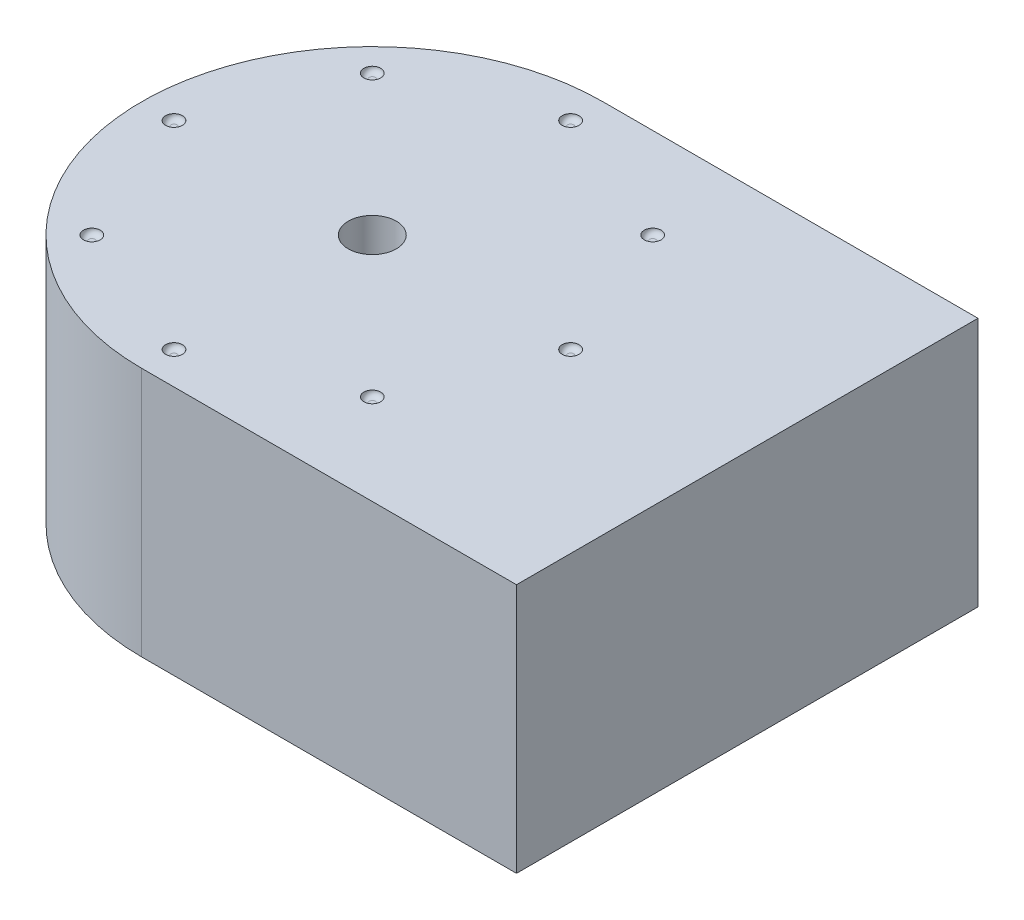
ISO-10303-21;
HEADER;
FILE_DESCRIPTION(('STEP AP214'),'2;1');
FILE_NAME('part.step','',(''),(''),'','','');
FILE_SCHEMA(('AUTOMOTIVE_DESIGN { 1 0 10303 214 1 1 1 1 }'));
ENDSEC;
DATA;
#1=APPLICATION_CONTEXT('core data for automotive mechanical design processes');
#2=APPLICATION_PROTOCOL_DEFINITION('international standard','automotive_design',2000,#1);
#3=PRODUCT_CONTEXT('',#1,'mechanical');
#4=PRODUCT('Part','Part','',(#3));
#5=PRODUCT_RELATED_PRODUCT_CATEGORY('part','',(#4));
#6=PRODUCT_DEFINITION_FORMATION('','',#4);
#7=PRODUCT_DEFINITION_CONTEXT('part definition',#1,'design');
#8=PRODUCT_DEFINITION('design','',#6,#7);
#9=PRODUCT_DEFINITION_SHAPE('','',#8);
#10=(LENGTH_UNIT() NAMED_UNIT(*) SI_UNIT(.MILLI.,.METRE.));
#11=(NAMED_UNIT(*) PLANE_ANGLE_UNIT() SI_UNIT($,.RADIAN.));
#12=(NAMED_UNIT(*) SI_UNIT($,.STERADIAN.) SOLID_ANGLE_UNIT());
#13=UNCERTAINTY_MEASURE_WITH_UNIT(LENGTH_MEASURE(1.E-05),#10,'distance_accuracy_value','');
#14=(GEOMETRIC_REPRESENTATION_CONTEXT(3) GLOBAL_UNCERTAINTY_ASSIGNED_CONTEXT((#13)) GLOBAL_UNIT_ASSIGNED_CONTEXT((#10,
#11,#12)) REPRESENTATION_CONTEXT('',''));
#15=CARTESIAN_POINT('',(0.,0.,0.));
#16=DIRECTION('',(0.,0.,1.));
#17=DIRECTION('',(1.,0.,0.));
#18=AXIS2_PLACEMENT_3D('',#15,#16,#17);
#19=CARTESIAN_POINT('',(0.,52.,-41.25));
#20=DIRECTION('',(0.,1.,0.));
#21=DIRECTION('',(0.,0.,1.));
#22=AXIS2_PLACEMENT_3D('',#19,#20,#21);
#23=DEGENERATE_TOROIDAL_SURFACE('',#22,0.650000000000002,1.1,.T.);
#24=CARTESIAN_POINT('',(0.,50.9,-41.25));
#25=DIRECTION('',(0.,1.,0.));
#26=DIRECTION('',(0.,0.,1.));
#27=AXIS2_PLACEMENT_3D('',#24,#25,#26);
#28=CIRCLE('',#27,0.650000000000002);
#29=CARTESIAN_POINT('',(0.,50.9,-40.6));
#30=VERTEX_POINT('',#29);
#31=EDGE_CURVE('E11',#30,#30,#28,.T.);
#32=ORIENTED_EDGE('',*,*,#31,.F.);
#33=EDGE_LOOP('',(#32));
#34=FACE_BOUND('',#33,.T.);
#35=CARTESIAN_POINT('',(0.,52.,-41.25));
#36=DIRECTION('',(0.,1.,0.));
#37=DIRECTION('',(0.,0.,1.));
#38=AXIS2_PLACEMENT_3D('',#35,#36,#37);
#39=CIRCLE('',#38,1.75);
#40=CARTESIAN_POINT('',(0.,52.,-39.5));
#41=VERTEX_POINT('',#40);
#42=EDGE_CURVE('E110',#41,#41,#39,.T.);
#43=ORIENTED_EDGE('',*,*,#42,.T.);
#44=EDGE_LOOP('',(#43));
#45=FACE_BOUND('',#44,.T.);
#46=ADVANCED_FACE('F40',(#34,#45),#23,.F.);
#47=CARTESIAN_POINT('',(0.,52.,0.));
#48=DIRECTION('',(0.,-1.,0.));
#49=DIRECTION('',(0.,0.,-1.));
#50=AXIS2_PLACEMENT_3D('',#47,#48,#49);
#51=CYLINDRICAL_SURFACE('',#50,48.);
#52=CARTESIAN_POINT('',(0.,0.,0.));
#53=DIRECTION('',(0.,1.,0.));
#54=DIRECTION('',(0.,0.,1.));
#55=AXIS2_PLACEMENT_3D('',#52,#53,#54);
#56=CIRCLE('',#55,48.);
#57=CARTESIAN_POINT('',(0.,0.,-48.));
#58=VERTEX_POINT('',#57);
#59=CARTESIAN_POINT('',(0.,0.,48.));
#60=VERTEX_POINT('',#59);
#61=EDGE_CURVE('E107',#58,#60,#56,.T.);
#62=ORIENTED_EDGE('',*,*,#61,.T.);
#63=DIRECTION('',(0.,-1.,0.));
#64=VECTOR('',#63,1.);
#65=CARTESIAN_POINT('',(0.,52.,48.));
#66=LINE('',#65,#64);
#67=CARTESIAN_POINT('',(0.,52.,48.));
#68=VERTEX_POINT('',#67);
#69=EDGE_CURVE('E48',#68,#60,#66,.T.);
#70=ORIENTED_EDGE('',*,*,#69,.F.);
#71=CARTESIAN_POINT('',(0.,52.,0.));
#72=DIRECTION('',(0.,1.,0.));
#73=DIRECTION('',(0.,0.,1.));
#74=AXIS2_PLACEMENT_3D('',#71,#72,#73);
#75=CIRCLE('',#74,48.);
#76=CARTESIAN_POINT('',(0.,52.,-48.));
#77=VERTEX_POINT('',#76);
#78=EDGE_CURVE('E83',#77,#68,#75,.T.);
#79=ORIENTED_EDGE('',*,*,#78,.F.);
#80=DIRECTION('',(0.,-1.,0.));
#81=VECTOR('',#80,1.);
#82=CARTESIAN_POINT('',(0.,52.,-48.));
#83=LINE('',#82,#81);
#84=EDGE_CURVE('E106',#77,#58,#83,.T.);
#85=ORIENTED_EDGE('',*,*,#84,.T.);
#86=EDGE_LOOP('',(#62,#70,#79,#85));
#87=FACE_BOUND('',#86,.T.);
#88=ADVANCED_FACE('F117',(#87),#51,.T.);
#89=CARTESIAN_POINT('',(0.,52.,48.));
#90=DIRECTION('',(0.,0.,1.));
#91=DIRECTION('',(1.,0.,0.));
#92=AXIS2_PLACEMENT_3D('',#89,#90,#91);
#93=PLANE('',#92);
#94=DIRECTION('',(-1.,0.,0.));
#95=VECTOR('',#94,1.);
#96=CARTESIAN_POINT('',(0.,0.,48.));
#97=LINE('',#96,#95);
#98=CARTESIAN_POINT('',(78.,0.,48.));
#99=VERTEX_POINT('',#98);
#100=EDGE_CURVE('E94',#99,#60,#97,.T.);
#101=ORIENTED_EDGE('',*,*,#100,.F.);
#102=DIRECTION('',(0.,-1.,0.));
#103=VECTOR('',#102,1.);
#104=CARTESIAN_POINT('',(78.,52.,48.));
#105=LINE('',#104,#103);
#106=CARTESIAN_POINT('',(78.,52.,48.));
#107=VERTEX_POINT('',#106);
#108=EDGE_CURVE('E89',#107,#99,#105,.T.);
#109=ORIENTED_EDGE('',*,*,#108,.F.);
#110=DIRECTION('',(-1.,0.,0.));
#111=VECTOR('',#110,1.);
#112=CARTESIAN_POINT('',(0.,52.,48.));
#113=LINE('',#112,#111);
#114=EDGE_CURVE('E92',#107,#68,#113,.T.);
#115=ORIENTED_EDGE('',*,*,#114,.T.);
#116=ORIENTED_EDGE('',*,*,#69,.T.);
#117=EDGE_LOOP('',(#101,#109,#115,#116));
#118=FACE_BOUND('',#117,.T.);
#119=ADVANCED_FACE('F91',(#118),#93,.T.);
#120=CARTESIAN_POINT('',(78.,52.,0.));
#121=DIRECTION('',(-1.,0.,0.));
#122=DIRECTION('',(0.,0.,1.));
#123=AXIS2_PLACEMENT_3D('',#120,#121,#122);
#124=PLANE('',#123);
#125=DIRECTION('',(0.,0.,-1.));
#126=VECTOR('',#125,1.);
#127=CARTESIAN_POINT('',(78.,0.,0.));
#128=LINE('',#127,#126);
#129=CARTESIAN_POINT('',(78.,0.,-48.));
#130=VERTEX_POINT('',#129);
#131=EDGE_CURVE('E72',#99,#130,#128,.T.);
#132=ORIENTED_EDGE('',*,*,#131,.T.);
#133=DIRECTION('',(0.,-1.,0.));
#134=VECTOR('',#133,1.);
#135=CARTESIAN_POINT('',(78.,52.,-48.));
#136=LINE('',#135,#134);
#137=CARTESIAN_POINT('',(78.,52.,-48.));
#138=VERTEX_POINT('',#137);
#139=EDGE_CURVE('E95',#138,#130,#136,.T.);
#140=ORIENTED_EDGE('',*,*,#139,.F.);
#141=DIRECTION('',(0.,0.,-1.));
#142=VECTOR('',#141,1.);
#143=CARTESIAN_POINT('',(78.,52.,0.));
#144=LINE('',#143,#142);
#145=EDGE_CURVE('E97',#107,#138,#144,.T.);
#146=ORIENTED_EDGE('',*,*,#145,.F.);
#147=ORIENTED_EDGE('',*,*,#108,.T.);
#148=EDGE_LOOP('',(#132,#140,#146,#147));
#149=FACE_BOUND('',#148,.T.);
#150=ADVANCED_FACE('F98',(#149),#124,.F.);
#151=CARTESIAN_POINT('',(0.,52.,-48.));
#152=DIRECTION('',(0.,0.,1.));
#153=DIRECTION('',(1.,0.,0.));
#154=AXIS2_PLACEMENT_3D('',#151,#152,#153);
#155=PLANE('',#154);
#156=DIRECTION('',(-1.,0.,0.));
#157=VECTOR('',#156,1.);
#158=CARTESIAN_POINT('',(0.,0.,-48.));
#159=LINE('',#158,#157);
#160=EDGE_CURVE('E78',#130,#58,#159,.T.);
#161=ORIENTED_EDGE('',*,*,#160,.T.);
#162=ORIENTED_EDGE('',*,*,#84,.F.);
#163=DIRECTION('',(-1.,0.,0.));
#164=VECTOR('',#163,1.);
#165=CARTESIAN_POINT('',(0.,52.,-48.));
#166=LINE('',#165,#164);
#167=EDGE_CURVE('E56',#138,#77,#166,.T.);
#168=ORIENTED_EDGE('',*,*,#167,.F.);
#169=ORIENTED_EDGE('',*,*,#139,.T.);
#170=EDGE_LOOP('',(#161,#162,#168,#169));
#171=FACE_BOUND('',#170,.T.);
#172=ADVANCED_FACE('F130',(#171),#155,.F.);
#173=CARTESIAN_POINT('',(0.,52.,0.));
#174=DIRECTION('',(0.,1.,0.));
#175=DIRECTION('',(0.,0.,1.));
#176=AXIS2_PLACEMENT_3D('',#173,#174,#175);
#177=PLANE('',#176);
#178=CARTESIAN_POINT('',(0.,52.,0.));
#179=DIRECTION('',(0.,1.,0.));
#180=DIRECTION('',(0.,0.,1.));
#181=AXIS2_PLACEMENT_3D('',#178,#179,#180);
#182=CIRCLE('',#181,5.);
#183=CARTESIAN_POINT('',(0.,52.,5.));
#184=VERTEX_POINT('',#183);
#185=EDGE_CURVE('E188',#184,#184,#182,.T.);
#186=ORIENTED_EDGE('',*,*,#185,.F.);
#187=EDGE_LOOP('',(#186));
#188=FACE_BOUND('',#187,.T.);
#189=CARTESIAN_POINT('',(-41.25,52.,1.44023605227279E-13));
#190=DIRECTION('',(0.,1.,0.));
#191=DIRECTION('',(1.,0.,0.));
#192=AXIS2_PLACEMENT_3D('',#189,#190,#191);
#193=CIRCLE('',#192,1.75);
#194=CARTESIAN_POINT('',(-39.5,52.,1.37913512884304E-13));
#195=VERTEX_POINT('',#194);
#196=EDGE_CURVE('E169',#195,#195,#193,.T.);
#197=ORIENTED_EDGE('',*,*,#196,.F.);
#198=EDGE_LOOP('',(#197));
#199=FACE_BOUND('',#198,.T.);
#200=CARTESIAN_POINT('',(-29.1681547239449,52.,29.1681547239452));
#201=DIRECTION('',(0.,1.,0.));
#202=DIRECTION('',(0.707106781186544,0.,-0.707106781186551));
#203=AXIS2_PLACEMENT_3D('',#200,#201,#202);
#204=CIRCLE('',#203,1.75);
#205=CARTESIAN_POINT('',(-27.9307178568685,52.,27.9307178568688));
#206=VERTEX_POINT('',#205);
#207=EDGE_CURVE('E163',#206,#206,#204,.T.);
#208=ORIENTED_EDGE('',*,*,#207,.F.);
#209=EDGE_LOOP('',(#208));
#210=FACE_BOUND('',#209,.T.);
#211=CARTESIAN_POINT('',(0.,52.,41.25));
#212=DIRECTION('',(0.,1.,0.));
#213=DIRECTION('',(0.,0.,-1.));
#214=AXIS2_PLACEMENT_3D('',#211,#212,#213);
#215=CIRCLE('',#214,1.75);
#216=CARTESIAN_POINT('',(0.,52.,39.5));
#217=VERTEX_POINT('',#216);
#218=EDGE_CURVE('E155',#217,#217,#215,.T.);
#219=ORIENTED_EDGE('',*,*,#218,.F.);
#220=EDGE_LOOP('',(#219));
#221=FACE_BOUND('',#220,.T.);
#222=CARTESIAN_POINT('',(29.1681547239453,52.,29.1681547239448));
#223=DIRECTION('',(0.,1.,0.));
#224=DIRECTION('',(-0.707106781186554,0.,-0.707106781186541));
#225=AXIS2_PLACEMENT_3D('',#222,#223,#224);
#226=CIRCLE('',#225,1.75);
#227=CARTESIAN_POINT('',(27.9307178568689,52.,27.9307178568684));
#228=VERTEX_POINT('',#227);
#229=EDGE_CURVE('E156',#228,#228,#226,.T.);
#230=ORIENTED_EDGE('',*,*,#229,.F.);
#231=EDGE_LOOP('',(#230));
#232=FACE_BOUND('',#231,.T.);
#233=CARTESIAN_POINT('',(41.25,52.,-4.32070815681838E-13));
#234=DIRECTION('',(0.,1.,0.));
#235=DIRECTION('',(-1.,0.,0.));
#236=AXIS2_PLACEMENT_3D('',#233,#234,#235);
#237=CIRCLE('',#236,1.75);
#238=CARTESIAN_POINT('',(39.5,52.,-4.13740538652911E-13));
#239=VERTEX_POINT('',#238);
#240=EDGE_CURVE('E179',#239,#239,#237,.T.);
#241=ORIENTED_EDGE('',*,*,#240,.F.);
#242=EDGE_LOOP('',(#241));
#243=FACE_BOUND('',#242,.T.);
#244=CARTESIAN_POINT('',(29.1681547239447,52.,-29.1681547239454));
#245=DIRECTION('',(0.,1.,0.));
#246=DIRECTION('',(-0.707106781186539,0.,0.707106781186556));
#247=AXIS2_PLACEMENT_3D('',#244,#245,#246);
#248=CIRCLE('',#247,1.75);
#249=CARTESIAN_POINT('',(27.9307178568683,52.,-27.930717856869));
#250=VERTEX_POINT('',#249);
#251=EDGE_CURVE('E180',#250,#250,#248,.T.);
#252=ORIENTED_EDGE('',*,*,#251,.F.);
#253=EDGE_LOOP('',(#252));
#254=FACE_BOUND('',#253,.T.);
#255=CARTESIAN_POINT('',(-29.1681547239451,52.,-29.168154723945));
#256=DIRECTION('',(0.,1.,0.));
#257=DIRECTION('',(0.707106781186549,0.,0.707106781186546));
#258=AXIS2_PLACEMENT_3D('',#255,#256,#257);
#259=CIRCLE('',#258,1.75);
#260=CARTESIAN_POINT('',(-27.9307178568687,52.,-27.9307178568686));
#261=VERTEX_POINT('',#260);
#262=EDGE_CURVE('E146',#261,#261,#259,.T.);
#263=ORIENTED_EDGE('',*,*,#262,.F.);
#264=EDGE_LOOP('',(#263));
#265=FACE_BOUND('',#264,.T.);
#266=ORIENTED_EDGE('',*,*,#42,.F.);
#267=EDGE_LOOP('',(#266));
#268=FACE_BOUND('',#267,.T.);
#269=ORIENTED_EDGE('',*,*,#78,.T.);
#270=ORIENTED_EDGE('',*,*,#114,.F.);
#271=ORIENTED_EDGE('',*,*,#145,.T.);
#272=ORIENTED_EDGE('',*,*,#167,.T.);
#273=EDGE_LOOP('',(#269,#270,#271,#272));
#274=FACE_BOUND('',#273,.T.);
#275=ADVANCED_FACE('F100',(#188,#199,#210,#221,#232,#243,#254,#265,#268,#274),#177,.T.);
#276=CARTESIAN_POINT('',(0.,0.,0.));
#277=DIRECTION('',(0.,1.,0.));
#278=DIRECTION('',(0.,0.,1.));
#279=AXIS2_PLACEMENT_3D('',#276,#277,#278);
#280=PLANE('',#279);
#281=ORIENTED_EDGE('',*,*,#61,.F.);
#282=ORIENTED_EDGE('',*,*,#160,.F.);
#283=ORIENTED_EDGE('',*,*,#131,.F.);
#284=ORIENTED_EDGE('',*,*,#100,.T.);
#285=EDGE_LOOP('',(#281,#282,#283,#284));
#286=FACE_BOUND('',#285,.T.);
#287=ADVANCED_FACE('F119',(#286),#280,.F.);
#288=CARTESIAN_POINT('',(0.,50.9,0.));
#289=DIRECTION('',(0.,1.,0.));
#290=DIRECTION('',(0.,0.,1.));
#291=AXIS2_PLACEMENT_3D('',#288,#289,#290);
#292=PLANE('',#291);
#293=ORIENTED_EDGE('',*,*,#31,.T.);
#294=EDGE_LOOP('',(#293));
#295=FACE_BOUND('',#294,.T.);
#296=ADVANCED_FACE('F121',(#295),#292,.T.);
#297=CARTESIAN_POINT('',(0.,50.9,0.));
#298=DIRECTION('',(0.,1.,0.));
#299=DIRECTION('',(0.707106781186549,0.,0.707106781186546));
#300=AXIS2_PLACEMENT_3D('',#297,#298,#299);
#301=PLANE('',#300);
#302=CARTESIAN_POINT('',(-29.1681547239451,50.9,-29.168154723945));
#303=DIRECTION('',(0.,1.,0.));
#304=DIRECTION('',(0.707106781186549,0.,0.707106781186546));
#305=AXIS2_PLACEMENT_3D('',#302,#303,#304);
#306=CIRCLE('',#305,0.650000000000002);
#307=CARTESIAN_POINT('',(-28.7085353161739,50.9,-28.7085353161738));
#308=VERTEX_POINT('',#307);
#309=EDGE_CURVE('E144',#308,#308,#306,.T.);
#310=ORIENTED_EDGE('',*,*,#309,.T.);
#311=EDGE_LOOP('',(#310));
#312=FACE_BOUND('',#311,.T.);
#313=ADVANCED_FACE('F127',(#312),#301,.T.);
#314=CARTESIAN_POINT('',(-29.1681547239451,52.,-29.168154723945));
#315=DIRECTION('',(0.,1.,0.));
#316=DIRECTION('',(0.707106781186549,0.,0.707106781186546));
#317=AXIS2_PLACEMENT_3D('',#314,#315,#316);
#318=DEGENERATE_TOROIDAL_SURFACE('',#317,0.650000000000002,1.1,.T.);
#319=ORIENTED_EDGE('',*,*,#309,.F.);
#320=EDGE_LOOP('',(#319));
#321=FACE_BOUND('',#320,.T.);
#322=ORIENTED_EDGE('',*,*,#262,.T.);
#323=EDGE_LOOP('',(#322));
#324=FACE_BOUND('',#323,.T.);
#325=ADVANCED_FACE('F217',(#321,#324),#318,.F.);
#326=CARTESIAN_POINT('',(0.,50.9,0.));
#327=DIRECTION('',(0.,1.,0.));
#328=DIRECTION('',(-0.707106781186539,0.,0.707106781186556));
#329=AXIS2_PLACEMENT_3D('',#326,#327,#328);
#330=PLANE('',#329);
#331=CARTESIAN_POINT('',(29.1681547239447,50.9,-29.1681547239454));
#332=DIRECTION('',(0.,1.,0.));
#333=DIRECTION('',(-0.707106781186539,0.,0.707106781186556));
#334=AXIS2_PLACEMENT_3D('',#331,#332,#333);
#335=CIRCLE('',#334,0.650000000000002);
#336=CARTESIAN_POINT('',(28.7085353161735,50.9,-28.7085353161742));
#337=VERTEX_POINT('',#336);
#338=EDGE_CURVE('E176',#337,#337,#335,.T.);
#339=ORIENTED_EDGE('',*,*,#338,.T.);
#340=EDGE_LOOP('',(#339));
#341=FACE_BOUND('',#340,.T.);
#342=ADVANCED_FACE('F219',(#341),#330,.T.);
#343=CARTESIAN_POINT('',(29.1681547239447,52.,-29.1681547239454));
#344=DIRECTION('',(0.,1.,0.));
#345=DIRECTION('',(-0.707106781186539,0.,0.707106781186556));
#346=AXIS2_PLACEMENT_3D('',#343,#344,#345);
#347=DEGENERATE_TOROIDAL_SURFACE('',#346,0.650000000000002,1.1,.T.);
#348=ORIENTED_EDGE('',*,*,#338,.F.);
#349=EDGE_LOOP('',(#348));
#350=FACE_BOUND('',#349,.T.);
#351=ORIENTED_EDGE('',*,*,#251,.T.);
#352=EDGE_LOOP('',(#351));
#353=FACE_BOUND('',#352,.T.);
#354=ADVANCED_FACE('F226',(#350,#353),#347,.F.);
#355=CARTESIAN_POINT('',(0.,50.9,0.));
#356=DIRECTION('',(0.,1.,0.));
#357=DIRECTION('',(-1.,0.,0.));
#358=AXIS2_PLACEMENT_3D('',#355,#356,#357);
#359=PLANE('',#358);
#360=CARTESIAN_POINT('',(41.25,50.9,-4.32070815681838E-13));
#361=DIRECTION('',(0.,1.,0.));
#362=DIRECTION('',(-1.,0.,0.));
#363=AXIS2_PLACEMENT_3D('',#360,#361,#362);
#364=CIRCLE('',#363,0.650000000000002);
#365=CARTESIAN_POINT('',(40.6,50.9,-4.25262427071094E-13));
#366=VERTEX_POINT('',#365);
#367=EDGE_CURVE('E159',#366,#366,#364,.T.);
#368=ORIENTED_EDGE('',*,*,#367,.T.);
#369=EDGE_LOOP('',(#368));
#370=FACE_BOUND('',#369,.T.);
#371=ADVANCED_FACE('F267',(#370),#359,.T.);
#372=CARTESIAN_POINT('',(41.25,52.,-4.32070815681838E-13));
#373=DIRECTION('',(0.,1.,0.));
#374=DIRECTION('',(-1.,0.,0.));
#375=AXIS2_PLACEMENT_3D('',#372,#373,#374);
#376=DEGENERATE_TOROIDAL_SURFACE('',#375,0.650000000000002,1.1,.T.);
#377=ORIENTED_EDGE('',*,*,#367,.F.);
#378=EDGE_LOOP('',(#377));
#379=FACE_BOUND('',#378,.T.);
#380=ORIENTED_EDGE('',*,*,#240,.T.);
#381=EDGE_LOOP('',(#380));
#382=FACE_BOUND('',#381,.T.);
#383=ADVANCED_FACE('F237',(#379,#382),#376,.F.);
#384=CARTESIAN_POINT('',(0.,50.9,0.));
#385=DIRECTION('',(0.,1.,0.));
#386=DIRECTION('',(-0.707106781186554,0.,-0.707106781186541));
#387=AXIS2_PLACEMENT_3D('',#384,#385,#386);
#388=PLANE('',#387);
#389=CARTESIAN_POINT('',(29.1681547239453,50.9,29.1681547239448));
#390=DIRECTION('',(0.,1.,0.));
#391=DIRECTION('',(-0.707106781186554,0.,-0.707106781186541));
#392=AXIS2_PLACEMENT_3D('',#389,#390,#391);
#393=CIRCLE('',#392,0.650000000000002);
#394=CARTESIAN_POINT('',(28.7085353161741,50.9,28.7085353161736));
#395=VERTEX_POINT('',#394);
#396=EDGE_CURVE('E152',#395,#395,#393,.T.);
#397=ORIENTED_EDGE('',*,*,#396,.T.);
#398=EDGE_LOOP('',(#397));
#399=FACE_BOUND('',#398,.T.);
#400=ADVANCED_FACE('F233',(#399),#388,.T.);
#401=CARTESIAN_POINT('',(29.1681547239453,52.,29.1681547239448));
#402=DIRECTION('',(0.,1.,0.));
#403=DIRECTION('',(-0.707106781186554,0.,-0.707106781186541));
#404=AXIS2_PLACEMENT_3D('',#401,#402,#403);
#405=DEGENERATE_TOROIDAL_SURFACE('',#404,0.650000000000002,1.1,.T.);
#406=ORIENTED_EDGE('',*,*,#396,.F.);
#407=EDGE_LOOP('',(#406));
#408=FACE_BOUND('',#407,.T.);
#409=ORIENTED_EDGE('',*,*,#229,.T.);
#410=EDGE_LOOP('',(#409));
#411=FACE_BOUND('',#410,.T.);
#412=ADVANCED_FACE('F236',(#408,#411),#405,.F.);
#413=CARTESIAN_POINT('',(0.,50.9,0.));
#414=DIRECTION('',(0.,1.,0.));
#415=DIRECTION('',(0.,0.,-1.));
#416=AXIS2_PLACEMENT_3D('',#413,#414,#415);
#417=PLANE('',#416);
#418=CARTESIAN_POINT('',(0.,50.9,41.25));
#419=DIRECTION('',(0.,1.,0.));
#420=DIRECTION('',(0.,0.,-1.));
#421=AXIS2_PLACEMENT_3D('',#418,#419,#420);
#422=CIRCLE('',#421,0.650000000000002);
#423=CARTESIAN_POINT('',(0.,50.9,40.6));
#424=VERTEX_POINT('',#423);
#425=EDGE_CURVE('E160',#424,#424,#422,.T.);
#426=ORIENTED_EDGE('',*,*,#425,.T.);
#427=EDGE_LOOP('',(#426));
#428=FACE_BOUND('',#427,.T.);
#429=ADVANCED_FACE('F241',(#428),#417,.T.);
#430=CARTESIAN_POINT('',(0.,52.,41.25));
#431=DIRECTION('',(0.,1.,0.));
#432=DIRECTION('',(0.,0.,-1.));
#433=AXIS2_PLACEMENT_3D('',#430,#431,#432);
#434=DEGENERATE_TOROIDAL_SURFACE('',#433,0.650000000000002,1.1,.T.);
#435=ORIENTED_EDGE('',*,*,#425,.F.);
#436=EDGE_LOOP('',(#435));
#437=FACE_BOUND('',#436,.T.);
#438=ORIENTED_EDGE('',*,*,#218,.T.);
#439=EDGE_LOOP('',(#438));
#440=FACE_BOUND('',#439,.T.);
#441=ADVANCED_FACE('F245',(#437,#440),#434,.F.);
#442=CARTESIAN_POINT('',(0.,50.9,0.));
#443=DIRECTION('',(0.,1.,0.));
#444=DIRECTION('',(0.707106781186544,0.,-0.707106781186551));
#445=AXIS2_PLACEMENT_3D('',#442,#443,#444);
#446=PLANE('',#445);
#447=CARTESIAN_POINT('',(-29.1681547239449,50.9,29.1681547239452));
#448=DIRECTION('',(0.,1.,0.));
#449=DIRECTION('',(0.707106781186544,0.,-0.707106781186551));
#450=AXIS2_PLACEMENT_3D('',#447,#448,#449);
#451=CIRCLE('',#450,0.650000000000002);
#452=CARTESIAN_POINT('',(-28.7085353161737,50.9,28.708535316174));
#453=VERTEX_POINT('',#452);
#454=EDGE_CURVE('E166',#453,#453,#451,.T.);
#455=ORIENTED_EDGE('',*,*,#454,.T.);
#456=EDGE_LOOP('',(#455));
#457=FACE_BOUND('',#456,.T.);
#458=ADVANCED_FACE('F249',(#457),#446,.T.);
#459=CARTESIAN_POINT('',(-29.1681547239449,52.,29.1681547239452));
#460=DIRECTION('',(0.,1.,0.));
#461=DIRECTION('',(0.707106781186544,0.,-0.707106781186551));
#462=AXIS2_PLACEMENT_3D('',#459,#460,#461);
#463=DEGENERATE_TOROIDAL_SURFACE('',#462,0.650000000000002,1.1,.T.);
#464=ORIENTED_EDGE('',*,*,#454,.F.);
#465=EDGE_LOOP('',(#464));
#466=FACE_BOUND('',#465,.T.);
#467=ORIENTED_EDGE('',*,*,#207,.T.);
#468=EDGE_LOOP('',(#467));
#469=FACE_BOUND('',#468,.T.);
#470=ADVANCED_FACE('F253',(#466,#469),#463,.F.);
#471=CARTESIAN_POINT('',(0.,50.9,0.));
#472=DIRECTION('',(0.,1.,0.));
#473=DIRECTION('',(1.,0.,0.));
#474=AXIS2_PLACEMENT_3D('',#471,#472,#473);
#475=PLANE('',#474);
#476=CARTESIAN_POINT('',(-41.25,50.9,1.44023605227279E-13));
#477=DIRECTION('',(0.,1.,0.));
#478=DIRECTION('',(1.,0.,0.));
#479=AXIS2_PLACEMENT_3D('',#476,#477,#478);
#480=CIRCLE('',#479,0.650000000000002);
#481=CARTESIAN_POINT('',(-40.6,50.9,1.41754142357031E-13));
#482=VERTEX_POINT('',#481);
#483=EDGE_CURVE('E151',#482,#482,#480,.T.);
#484=ORIENTED_EDGE('',*,*,#483,.T.);
#485=EDGE_LOOP('',(#484));
#486=FACE_BOUND('',#485,.T.);
#487=ADVANCED_FACE('F257',(#486),#475,.T.);
#488=CARTESIAN_POINT('',(-41.25,52.,1.44023605227279E-13));
#489=DIRECTION('',(0.,1.,0.));
#490=DIRECTION('',(1.,0.,0.));
#491=AXIS2_PLACEMENT_3D('',#488,#489,#490);
#492=DEGENERATE_TOROIDAL_SURFACE('',#491,0.650000000000002,1.1,.T.);
#493=ORIENTED_EDGE('',*,*,#483,.F.);
#494=EDGE_LOOP('',(#493));
#495=FACE_BOUND('',#494,.T.);
#496=ORIENTED_EDGE('',*,*,#196,.T.);
#497=EDGE_LOOP('',(#496));
#498=FACE_BOUND('',#497,.T.);
#499=ADVANCED_FACE('F199',(#495,#498),#492,.F.);
#500=CARTESIAN_POINT('',(0.,42.,0.));
#501=DIRECTION('',(0.,1.,0.));
#502=DIRECTION('',(0.,0.,1.));
#503=AXIS2_PLACEMENT_3D('',#500,#501,#502);
#504=CYLINDRICAL_SURFACE('',#503,5.);
#505=CARTESIAN_POINT('',(0.,42.,0.));
#506=DIRECTION('',(0.,1.,0.));
#507=DIRECTION('',(0.,0.,1.));
#508=AXIS2_PLACEMENT_3D('',#505,#506,#507);
#509=CIRCLE('',#508,5.);
#510=CARTESIAN_POINT('',(0.,42.,5.));
#511=VERTEX_POINT('',#510);
#512=EDGE_CURVE('E183',#511,#511,#509,.T.);
#513=ORIENTED_EDGE('',*,*,#512,.F.);
#514=EDGE_LOOP('',(#513));
#515=FACE_BOUND('',#514,.T.);
#516=ORIENTED_EDGE('',*,*,#185,.T.);
#517=EDGE_LOOP('',(#516));
#518=FACE_BOUND('',#517,.T.);
#519=ADVANCED_FACE('F196',(#515,#518),#504,.F.);
#520=CARTESIAN_POINT('',(0.,42.,0.));
#521=DIRECTION('',(0.,1.,0.));
#522=DIRECTION('',(0.,0.,1.));
#523=AXIS2_PLACEMENT_3D('',#520,#521,#522);
#524=PLANE('',#523);
#525=ORIENTED_EDGE('',*,*,#512,.T.);
#526=EDGE_LOOP('',(#525));
#527=FACE_BOUND('',#526,.T.);
#528=ADVANCED_FACE('F194',(#527),#524,.T.);
#529=CLOSED_SHELL('',(#46,#88,#119,#150,#172,#275,#287,#296,#313,#325,#342,#354,#371,#383,#400,
#412,#429,#441,#458,#470,#487,#499,#519,#528));
#530=MANIFOLD_SOLID_BREP('B2',#529);
#531=ADVANCED_BREP_SHAPE_REPRESENTATION('',(#18,#530),#14);
#532=SHAPE_DEFINITION_REPRESENTATION(#9,#531);
ENDSEC;
END-ISO-10303-21;
